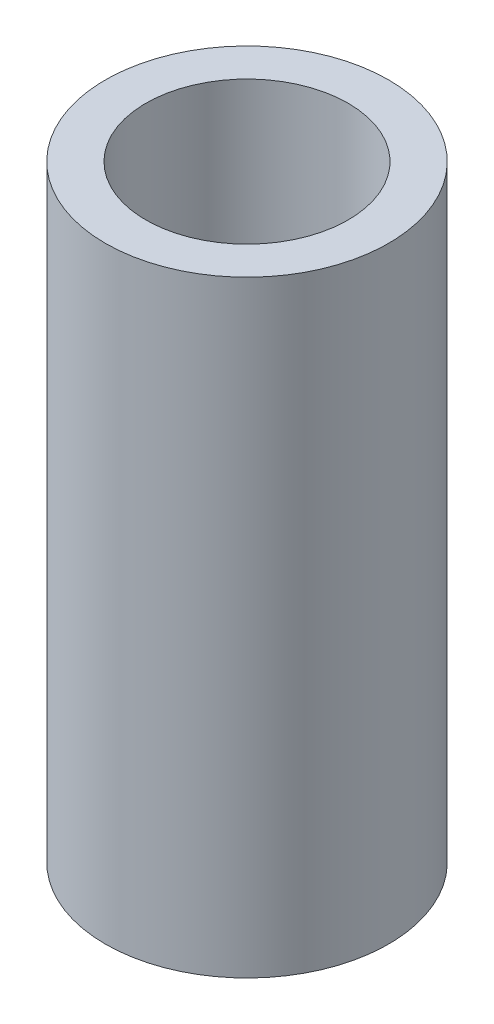
ISO-10303-21;
HEADER;
FILE_DESCRIPTION(('STEP AP214'),'2;1');
FILE_NAME('part.step','',(''),(''),'','','');
FILE_SCHEMA(('AUTOMOTIVE_DESIGN { 1 0 10303 214 1 1 1 1 }'));
ENDSEC;
DATA;
#1=APPLICATION_CONTEXT('core data for automotive mechanical design processes');
#2=APPLICATION_PROTOCOL_DEFINITION('international standard','automotive_design',2000,#1);
#3=PRODUCT_CONTEXT('',#1,'mechanical');
#4=PRODUCT('Part','Part','',(#3));
#5=PRODUCT_RELATED_PRODUCT_CATEGORY('part','',(#4));
#6=PRODUCT_DEFINITION_FORMATION('','',#4);
#7=PRODUCT_DEFINITION_CONTEXT('part definition',#1,'design');
#8=PRODUCT_DEFINITION('design','',#6,#7);
#9=PRODUCT_DEFINITION_SHAPE('','',#8);
#10=(LENGTH_UNIT() NAMED_UNIT(*) SI_UNIT(.MILLI.,.METRE.));
#11=(NAMED_UNIT(*) PLANE_ANGLE_UNIT() SI_UNIT($,.RADIAN.));
#12=(NAMED_UNIT(*) SI_UNIT($,.STERADIAN.) SOLID_ANGLE_UNIT());
#13=UNCERTAINTY_MEASURE_WITH_UNIT(LENGTH_MEASURE(1.E-05),#10,'distance_accuracy_value','');
#14=(GEOMETRIC_REPRESENTATION_CONTEXT(3) GLOBAL_UNCERTAINTY_ASSIGNED_CONTEXT((#13)) GLOBAL_UNIT_ASSIGNED_CONTEXT((#10,
#11,#12)) REPRESENTATION_CONTEXT('',''));
#15=CARTESIAN_POINT('',(0.,0.,0.));
#16=DIRECTION('',(0.,0.,1.));
#17=DIRECTION('',(1.,0.,0.));
#18=AXIS2_PLACEMENT_3D('',#15,#16,#17);
#19=CARTESIAN_POINT('',(0.,19.05,0.));
#20=DIRECTION('',(0.,1.,0.));
#21=DIRECTION('',(0.,0.,1.));
#22=AXIS2_PLACEMENT_3D('',#19,#20,#21);
#23=PLANE('',#22);
#24=CARTESIAN_POINT('',(0.,19.05,0.));
#25=DIRECTION('',(0.,1.,0.));
#26=DIRECTION('',(0.,0.,1.));
#27=AXIS2_PLACEMENT_3D('',#24,#25,#26);
#28=CIRCLE('',#27,4.445);
#29=CARTESIAN_POINT('',(0.,19.05,-4.445));
#30=VERTEX_POINT('',#29);
#31=EDGE_CURVE('E10',#30,#30,#28,.T.);
#32=ORIENTED_EDGE('',*,*,#31,.T.);
#33=EDGE_LOOP('',(#32));
#34=FACE_BOUND('',#33,.T.);
#35=CARTESIAN_POINT('',(0.,19.05,0.));
#36=DIRECTION('',(0.,1.,0.));
#37=DIRECTION('',(0.,0.,1.));
#38=AXIS2_PLACEMENT_3D('',#35,#36,#37);
#39=CIRCLE('',#38,3.175);
#40=CARTESIAN_POINT('',(0.,19.05,-3.175));
#41=VERTEX_POINT('',#40);
#42=EDGE_CURVE('E50',#41,#41,#39,.T.);
#43=ORIENTED_EDGE('',*,*,#42,.F.);
#44=EDGE_LOOP('',(#43));
#45=FACE_BOUND('',#44,.T.);
#46=ADVANCED_FACE('F37',(#34,#45),#23,.T.);
#47=CARTESIAN_POINT('',(0.,0.,0.));
#48=DIRECTION('',(0.,1.,0.));
#49=DIRECTION('',(0.,0.,1.));
#50=AXIS2_PLACEMENT_3D('',#47,#48,#49);
#51=PLANE('',#50);
#52=CARTESIAN_POINT('',(0.,0.,0.));
#53=DIRECTION('',(0.,1.,0.));
#54=DIRECTION('',(0.,0.,1.));
#55=AXIS2_PLACEMENT_3D('',#52,#53,#54);
#56=CIRCLE('',#55,4.445);
#57=CARTESIAN_POINT('',(0.,0.,-4.445));
#58=VERTEX_POINT('',#57);
#59=EDGE_CURVE('E41',#58,#58,#56,.T.);
#60=ORIENTED_EDGE('',*,*,#59,.F.);
#61=EDGE_LOOP('',(#60));
#62=FACE_BOUND('',#61,.T.);
#63=CARTESIAN_POINT('',(0.,0.,0.));
#64=DIRECTION('',(0.,1.,0.));
#65=DIRECTION('',(0.,0.,1.));
#66=AXIS2_PLACEMENT_3D('',#63,#64,#65);
#67=CIRCLE('',#66,3.175);
#68=CARTESIAN_POINT('',(0.,0.,-3.175));
#69=VERTEX_POINT('',#68);
#70=EDGE_CURVE('E52',#69,#69,#67,.T.);
#71=ORIENTED_EDGE('',*,*,#70,.T.);
#72=EDGE_LOOP('',(#71));
#73=FACE_BOUND('',#72,.T.);
#74=ADVANCED_FACE('F64',(#62,#73),#51,.F.);
#75=CARTESIAN_POINT('',(0.,19.05,0.));
#76=DIRECTION('',(0.,-1.,0.));
#77=DIRECTION('',(0.,0.,-1.));
#78=AXIS2_PLACEMENT_3D('',#75,#76,#77);
#79=CYLINDRICAL_SURFACE('',#78,4.445);
#80=CARTESIAN_POINT('',(0.,19.05,-4.445));
#81=CARTESIAN_POINT('',(0.,18.8515625,-4.445));
#82=CARTESIAN_POINT('',(0.,18.653125,-4.445));
#83=CARTESIAN_POINT('',(0.,18.25625,-4.445));
#84=CARTESIAN_POINT('',(0.,18.0578125,-4.445));
#85=CARTESIAN_POINT('',(0.,17.6609375,-4.445));
#86=CARTESIAN_POINT('',(0.,17.4625,-4.445));
#87=CARTESIAN_POINT('',(0.,17.065625,-4.445));
#88=CARTESIAN_POINT('',(0.,16.8671875,-4.445));
#89=CARTESIAN_POINT('',(0.,16.4703125,-4.445));
#90=CARTESIAN_POINT('',(0.,16.271875,-4.445));
#91=CARTESIAN_POINT('',(0.,15.875,-4.445));
#92=CARTESIAN_POINT('',(0.,15.6765625,-4.445));
#93=CARTESIAN_POINT('',(0.,15.2796875,-4.445));
#94=CARTESIAN_POINT('',(0.,15.08125,-4.445));
#95=CARTESIAN_POINT('',(0.,14.684375,-4.445));
#96=CARTESIAN_POINT('',(0.,14.4859375,-4.445));
#97=CARTESIAN_POINT('',(0.,14.0890625,-4.445));
#98=CARTESIAN_POINT('',(0.,13.890625,-4.445));
#99=CARTESIAN_POINT('',(0.,13.49375,-4.445));
#100=CARTESIAN_POINT('',(0.,13.2953125,-4.445));
#101=CARTESIAN_POINT('',(0.,12.8984375,-4.445));
#102=CARTESIAN_POINT('',(0.,12.7,-4.445));
#103=CARTESIAN_POINT('',(0.,12.303125,-4.445));
#104=CARTESIAN_POINT('',(0.,12.1046875,-4.445));
#105=CARTESIAN_POINT('',(0.,11.7078125,-4.445));
#106=CARTESIAN_POINT('',(0.,11.509375,-4.445));
#107=CARTESIAN_POINT('',(0.,11.1125,-4.445));
#108=CARTESIAN_POINT('',(0.,10.9140625,-4.445));
#109=CARTESIAN_POINT('',(0.,10.5171875,-4.445));
#110=CARTESIAN_POINT('',(0.,10.31875,-4.445));
#111=CARTESIAN_POINT('',(0.,9.921875,-4.445));
#112=CARTESIAN_POINT('',(0.,9.7234375,-4.445));
#113=CARTESIAN_POINT('',(0.,9.3265625,-4.445));
#114=CARTESIAN_POINT('',(0.,9.128125,-4.445));
#115=CARTESIAN_POINT('',(0.,8.73125,-4.445));
#116=CARTESIAN_POINT('',(0.,8.5328125,-4.445));
#117=CARTESIAN_POINT('',(0.,8.1359375,-4.445));
#118=CARTESIAN_POINT('',(0.,7.9375,-4.445));
#119=CARTESIAN_POINT('',(0.,7.540625,-4.445));
#120=CARTESIAN_POINT('',(0.,7.3421875,-4.445));
#121=CARTESIAN_POINT('',(0.,6.9453125,-4.445));
#122=CARTESIAN_POINT('',(0.,6.746875,-4.445));
#123=CARTESIAN_POINT('',(0.,6.35,-4.445));
#124=CARTESIAN_POINT('',(0.,6.1515625,-4.445));
#125=CARTESIAN_POINT('',(0.,5.7546875,-4.445));
#126=CARTESIAN_POINT('',(0.,5.55625,-4.445));
#127=CARTESIAN_POINT('',(0.,5.159375,-4.445));
#128=CARTESIAN_POINT('',(0.,4.9609375,-4.445));
#129=CARTESIAN_POINT('',(0.,4.5640625,-4.445));
#130=CARTESIAN_POINT('',(0.,4.365625,-4.445));
#131=CARTESIAN_POINT('',(0.,3.96875,-4.445));
#132=CARTESIAN_POINT('',(0.,3.7703125,-4.445));
#133=CARTESIAN_POINT('',(0.,3.3734375,-4.445));
#134=CARTESIAN_POINT('',(0.,3.175,-4.445));
#135=CARTESIAN_POINT('',(0.,2.778125,-4.445));
#136=CARTESIAN_POINT('',(0.,2.5796875,-4.445));
#137=CARTESIAN_POINT('',(0.,2.1828125,-4.445));
#138=CARTESIAN_POINT('',(0.,1.984375,-4.445));
#139=CARTESIAN_POINT('',(0.,1.5875,-4.445));
#140=CARTESIAN_POINT('',(0.,1.3890625,-4.445));
#141=CARTESIAN_POINT('',(0.,0.992187500000001,-4.445));
#142=CARTESIAN_POINT('',(0.,0.793750000000001,-4.445));
#143=CARTESIAN_POINT('',(0.,0.396875,-4.445));
#144=CARTESIAN_POINT('',(0.,0.1984375,-4.445));
#145=CARTESIAN_POINT('',(0.,0.,-4.445));
#146=B_SPLINE_CURVE_WITH_KNOTS('',3,(#80,#81,#82,#83,#84,#85,#86,#87,#88,#89,#90,#91,#92,#93,
#94,#95,#96,#97,#98,#99,#100,#101,#102,#103,#104,#105,#106,#107,#108,#109,#110,#111,#112,#113,
#114,#115,#116,#117,#118,#119,#120,#121,#122,#123,#124,#125,#126,#127,#128,#129,#130,#131,#132,
#133,#134,#135,#136,#137,#138,#139,#140,#141,#142,#143,#144,#145),.UNSPECIFIED.,.F.,.F.,(4,2,2,
2,2,2,2,2,2,2,2,2,2,2,2,2,2,2,2,2,2,2,2,2,2,2,2,2,2,2,2,2,4),(0.,0.595312499999997,1.190625,
1.7859375,2.38125,2.9765625,3.571875,4.1671875,4.7625,5.3578125,5.953125,6.5484375,7.14375,
7.7390625,8.334375,8.9296875,9.525,10.1203125,10.715625,11.3109375,11.90625,12.5015625,
13.096875,13.6921875,14.2875,14.8828125,15.478125,16.0734375,16.66875,17.2640625,17.859375,
18.4546875,19.05),.UNSPECIFIED.);
#147=EDGE_CURVE('BSEAM39',#30,#58,#146,.T.);
#148=ORIENTED_EDGE('',*,*,#31,.F.);
#149=ORIENTED_EDGE('',*,*,#59,.T.);
#150=ORIENTED_EDGE('',*,*,#147,.T.);
#151=ORIENTED_EDGE('',*,*,#147,.F.);
#152=EDGE_LOOP('',(#148,#150,#149,#151));
#153=FACE_BOUND('',#152,.T.);
#154=ADVANCED_FACE('F39',(#153),#79,.T.);
#155=CARTESIAN_POINT('',(0.,19.05,0.));
#156=DIRECTION('',(0.,-1.,0.));
#157=DIRECTION('',(0.,0.,-1.));
#158=AXIS2_PLACEMENT_3D('',#155,#156,#157);
#159=CYLINDRICAL_SURFACE('',#158,3.175);
#160=CARTESIAN_POINT('',(0.,19.05,-3.175));
#161=CARTESIAN_POINT('',(0.,18.8515625,-3.175));
#162=CARTESIAN_POINT('',(0.,18.653125,-3.175));
#163=CARTESIAN_POINT('',(0.,18.25625,-3.175));
#164=CARTESIAN_POINT('',(0.,18.0578125,-3.175));
#165=CARTESIAN_POINT('',(0.,17.6609375,-3.175));
#166=CARTESIAN_POINT('',(0.,17.4625,-3.175));
#167=CARTESIAN_POINT('',(0.,17.065625,-3.175));
#168=CARTESIAN_POINT('',(0.,16.8671875,-3.175));
#169=CARTESIAN_POINT('',(0.,16.4703125,-3.175));
#170=CARTESIAN_POINT('',(0.,16.271875,-3.175));
#171=CARTESIAN_POINT('',(0.,15.875,-3.175));
#172=CARTESIAN_POINT('',(0.,15.6765625,-3.175));
#173=CARTESIAN_POINT('',(0.,15.2796875,-3.175));
#174=CARTESIAN_POINT('',(0.,15.08125,-3.175));
#175=CARTESIAN_POINT('',(0.,14.684375,-3.175));
#176=CARTESIAN_POINT('',(0.,14.4859375,-3.175));
#177=CARTESIAN_POINT('',(0.,14.0890625,-3.175));
#178=CARTESIAN_POINT('',(0.,13.890625,-3.175));
#179=CARTESIAN_POINT('',(0.,13.49375,-3.175));
#180=CARTESIAN_POINT('',(0.,13.2953125,-3.175));
#181=CARTESIAN_POINT('',(0.,12.8984375,-3.175));
#182=CARTESIAN_POINT('',(0.,12.7,-3.175));
#183=CARTESIAN_POINT('',(0.,12.303125,-3.175));
#184=CARTESIAN_POINT('',(0.,12.1046875,-3.175));
#185=CARTESIAN_POINT('',(0.,11.7078125,-3.175));
#186=CARTESIAN_POINT('',(0.,11.509375,-3.175));
#187=CARTESIAN_POINT('',(0.,11.1125,-3.175));
#188=CARTESIAN_POINT('',(0.,10.9140625,-3.175));
#189=CARTESIAN_POINT('',(0.,10.5171875,-3.175));
#190=CARTESIAN_POINT('',(0.,10.31875,-3.175));
#191=CARTESIAN_POINT('',(0.,9.921875,-3.175));
#192=CARTESIAN_POINT('',(0.,9.7234375,-3.175));
#193=CARTESIAN_POINT('',(0.,9.3265625,-3.175));
#194=CARTESIAN_POINT('',(0.,9.128125,-3.175));
#195=CARTESIAN_POINT('',(0.,8.73125,-3.175));
#196=CARTESIAN_POINT('',(0.,8.5328125,-3.175));
#197=CARTESIAN_POINT('',(0.,8.1359375,-3.175));
#198=CARTESIAN_POINT('',(0.,7.9375,-3.175));
#199=CARTESIAN_POINT('',(0.,7.540625,-3.175));
#200=CARTESIAN_POINT('',(0.,7.3421875,-3.175));
#201=CARTESIAN_POINT('',(0.,6.9453125,-3.175));
#202=CARTESIAN_POINT('',(0.,6.746875,-3.175));
#203=CARTESIAN_POINT('',(0.,6.35,-3.175));
#204=CARTESIAN_POINT('',(0.,6.1515625,-3.175));
#205=CARTESIAN_POINT('',(0.,5.7546875,-3.175));
#206=CARTESIAN_POINT('',(0.,5.55625,-3.175));
#207=CARTESIAN_POINT('',(0.,5.159375,-3.175));
#208=CARTESIAN_POINT('',(0.,4.9609375,-3.175));
#209=CARTESIAN_POINT('',(0.,4.5640625,-3.175));
#210=CARTESIAN_POINT('',(0.,4.365625,-3.175));
#211=CARTESIAN_POINT('',(0.,3.96875,-3.175));
#212=CARTESIAN_POINT('',(0.,3.7703125,-3.175));
#213=CARTESIAN_POINT('',(0.,3.3734375,-3.175));
#214=CARTESIAN_POINT('',(0.,3.175,-3.175));
#215=CARTESIAN_POINT('',(0.,2.778125,-3.175));
#216=CARTESIAN_POINT('',(0.,2.5796875,-3.175));
#217=CARTESIAN_POINT('',(0.,2.1828125,-3.175));
#218=CARTESIAN_POINT('',(0.,1.984375,-3.175));
#219=CARTESIAN_POINT('',(0.,1.5875,-3.175));
#220=CARTESIAN_POINT('',(0.,1.3890625,-3.175));
#221=CARTESIAN_POINT('',(0.,0.992187500000001,-3.175));
#222=CARTESIAN_POINT('',(0.,0.793750000000001,-3.175));
#223=CARTESIAN_POINT('',(0.,0.396875,-3.175));
#224=CARTESIAN_POINT('',(0.,0.1984375,-3.175));
#225=CARTESIAN_POINT('',(0.,0.,-3.175));
#226=B_SPLINE_CURVE_WITH_KNOTS('',3,(#160,#161,#162,#163,#164,#165,#166,#167,#168,#169,#170,
#171,#172,#173,#174,#175,#176,#177,#178,#179,#180,#181,#182,#183,#184,#185,#186,#187,#188,#189,
#190,#191,#192,#193,#194,#195,#196,#197,#198,#199,#200,#201,#202,#203,#204,#205,#206,#207,#208,
#209,#210,#211,#212,#213,#214,#215,#216,#217,#218,#219,#220,#221,#222,#223,#224,#225),
.UNSPECIFIED.,.F.,.F.,(4,2,2,2,2,2,2,2,2,2,2,2,2,2,2,2,2,2,2,2,2,2,2,2,2,2,2,2,2,2,2,2,4),(0.,
0.595312499999997,1.190625,1.7859375,2.38125,2.9765625,3.571875,4.1671875,4.7625,5.3578125,
5.953125,6.5484375,7.14375,7.7390625,8.334375,8.9296875,9.525,10.1203125,10.715625,11.3109375,
11.90625,12.5015625,13.096875,13.6921875,14.2875,14.8828125,15.478125,16.0734375,16.66875,
17.2640625,17.859375,18.4546875,19.05),.UNSPECIFIED.);
#227=EDGE_CURVE('BSEAM60',#41,#69,#226,.T.);
#228=ORIENTED_EDGE('',*,*,#42,.T.);
#229=ORIENTED_EDGE('',*,*,#70,.F.);
#230=ORIENTED_EDGE('',*,*,#227,.T.);
#231=ORIENTED_EDGE('',*,*,#227,.F.);
#232=EDGE_LOOP('',(#228,#230,#229,#231));
#233=FACE_BOUND('',#232,.T.);
#234=ADVANCED_FACE('F60',(#233),#159,.F.);
#235=CLOSED_SHELL('',(#46,#74,#154,#234));
#236=MANIFOLD_SOLID_BREP('B2',#235);
#237=ADVANCED_BREP_SHAPE_REPRESENTATION('',(#18,#236),#14);
#238=SHAPE_DEFINITION_REPRESENTATION(#9,#237);
ENDSEC;
END-ISO-10303-21;
